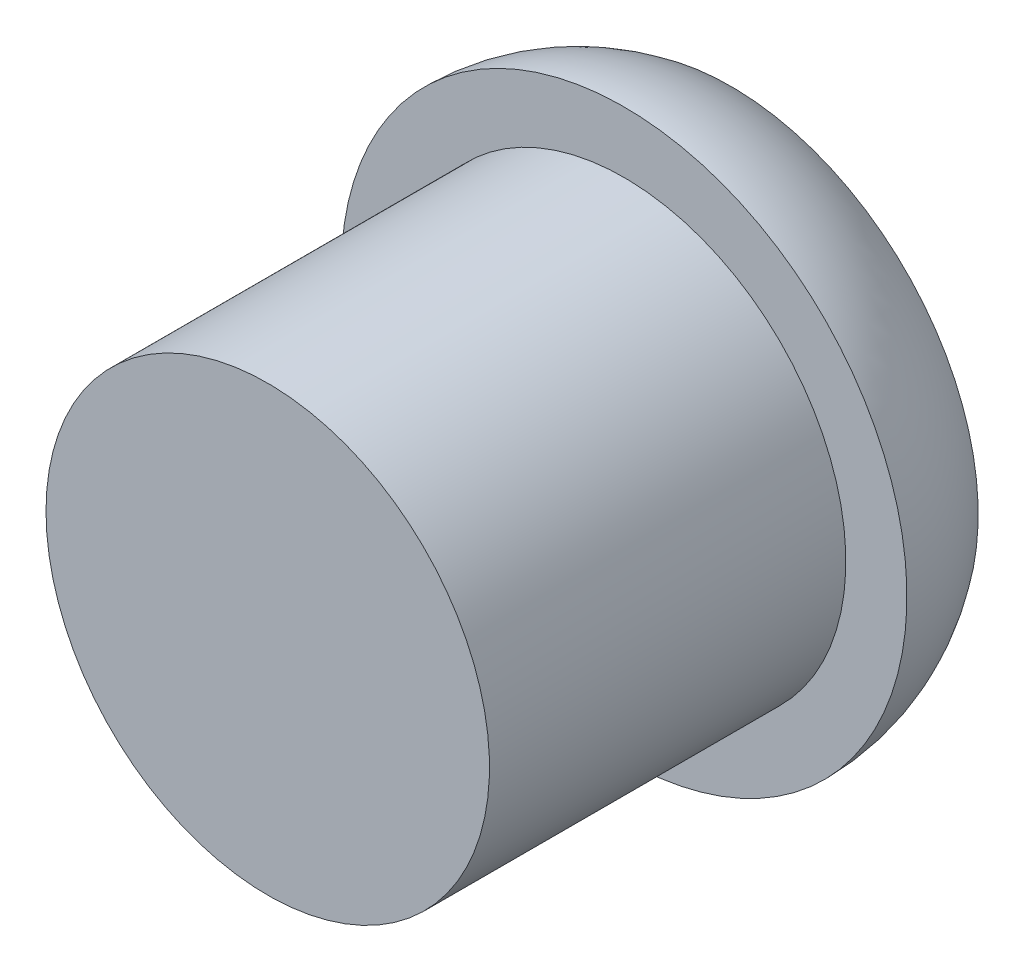
ISO-10303-21;
HEADER;
FILE_DESCRIPTION(('STEP AP214'),'2;1');
FILE_NAME('part.step','',(''),(''),'','','');
FILE_SCHEMA(('AUTOMOTIVE_DESIGN { 1 0 10303 214 1 1 1 1 }'));
ENDSEC;
DATA;
#1=APPLICATION_CONTEXT('core data for automotive mechanical design processes');
#2=APPLICATION_PROTOCOL_DEFINITION('international standard','automotive_design',2000,#1);
#3=PRODUCT_CONTEXT('',#1,'mechanical');
#4=PRODUCT('Part','Part','',(#3));
#5=PRODUCT_RELATED_PRODUCT_CATEGORY('part','',(#4));
#6=PRODUCT_DEFINITION_FORMATION('','',#4);
#7=PRODUCT_DEFINITION_CONTEXT('part definition',#1,'design');
#8=PRODUCT_DEFINITION('design','',#6,#7);
#9=PRODUCT_DEFINITION_SHAPE('','',#8);
#10=(LENGTH_UNIT() NAMED_UNIT(*) SI_UNIT(.MILLI.,.METRE.));
#11=(NAMED_UNIT(*) PLANE_ANGLE_UNIT() SI_UNIT($,.RADIAN.));
#12=(NAMED_UNIT(*) SI_UNIT($,.STERADIAN.) SOLID_ANGLE_UNIT());
#13=UNCERTAINTY_MEASURE_WITH_UNIT(LENGTH_MEASURE(1.E-05),#10,'distance_accuracy_value','');
#14=(GEOMETRIC_REPRESENTATION_CONTEXT(3) GLOBAL_UNCERTAINTY_ASSIGNED_CONTEXT((#13)) GLOBAL_UNIT_ASSIGNED_CONTEXT((#10,
#11,#12)) REPRESENTATION_CONTEXT('',''));
#15=CARTESIAN_POINT('',(0.,0.,0.));
#16=DIRECTION('',(0.,0.,1.));
#17=DIRECTION('',(1.,0.,0.));
#18=AXIS2_PLACEMENT_3D('',#15,#16,#17);
#19=CARTESIAN_POINT('',(0.,0.,10.));
#20=DIRECTION('',(0.,0.,-1.));
#21=DIRECTION('',(-1.,0.,0.));
#22=AXIS2_PLACEMENT_3D('',#19,#20,#21);
#23=PLANE('',#22);
#24=CARTESIAN_POINT('',(0.,0.,10.));
#25=DIRECTION('',(0.,0.,-1.));
#26=DIRECTION('',(-1.,0.,0.));
#27=AXIS2_PLACEMENT_3D('',#24,#25,#26);
#28=CIRCLE('',#27,6.223);
#29=CARTESIAN_POINT('',(-6.223,0.,10.));
#30=VERTEX_POINT('',#29);
#31=EDGE_CURVE('E10',#30,#30,#28,.T.);
#32=ORIENTED_EDGE('',*,*,#31,.F.);
#33=EDGE_LOOP('',(#32));
#34=FACE_BOUND('',#33,.T.);
#35=ADVANCED_FACE('F32',(#34),#23,.F.);
#36=CARTESIAN_POINT('',(0.,0.,-6.));
#37=DIRECTION('',(0.,0.,-1.));
#38=DIRECTION('',(-1.,0.,0.));
#39=AXIS2_PLACEMENT_3D('',#36,#37,#38);
#40=CYLINDRICAL_SURFACE('',#39,6.223);
#41=CARTESIAN_POINT('',(0.,0.,0.));
#42=DIRECTION('',(0.,0.,-1.));
#43=DIRECTION('',(-1.,0.,0.));
#44=AXIS2_PLACEMENT_3D('',#41,#42,#43);
#45=CIRCLE('',#44,6.223);
#46=CARTESIAN_POINT('',(-6.223,0.,0.));
#47=VERTEX_POINT('',#46);
#48=EDGE_CURVE('E38',#47,#47,#45,.T.);
#49=ORIENTED_EDGE('',*,*,#48,.F.);
#50=EDGE_LOOP('',(#49));
#51=FACE_BOUND('',#50,.T.);
#52=ORIENTED_EDGE('',*,*,#31,.T.);
#53=EDGE_LOOP('',(#52));
#54=FACE_BOUND('',#53,.T.);
#55=ADVANCED_FACE('F71',(#51,#54),#40,.T.);
#56=CARTESIAN_POINT('',(6.223,0.,0.));
#57=DIRECTION('',(0.,0.,-1.));
#58=DIRECTION('',(-1.,0.,0.));
#59=AXIS2_PLACEMENT_3D('',#56,#57,#58);
#60=PLANE('',#59);
#61=CARTESIAN_POINT('',(0.,0.,0.));
#62=DIRECTION('',(0.,0.,-1.));
#63=DIRECTION('',(-1.,0.,0.));
#64=AXIS2_PLACEMENT_3D('',#61,#62,#63);
#65=CIRCLE('',#64,7.9375);
#66=CARTESIAN_POINT('',(-7.9375,0.,0.));
#67=VERTEX_POINT('',#66);
#68=EDGE_CURVE('E42',#67,#67,#65,.T.);
#69=ORIENTED_EDGE('',*,*,#68,.F.);
#70=EDGE_LOOP('',(#69));
#71=FACE_BOUND('',#70,.T.);
#72=ORIENTED_EDGE('',*,*,#48,.T.);
#73=EDGE_LOOP('',(#72));
#74=FACE_BOUND('',#73,.T.);
#75=ADVANCED_FACE('F66',(#71,#74),#60,.F.);
#76=CARTESIAN_POINT('',(0.,0.,0.));
#77=DIRECTION('',(0.,0.,-1.));
#78=DIRECTION('',(-1.,0.,0.));
#79=AXIS2_PLACEMENT_3D('',#76,#77,#78);
#80=DEGENERATE_TOROIDAL_SURFACE('',#79,2.9375,5.,.T.);
#81=CARTESIAN_POINT('',(0.,0.,-3.));
#82=DIRECTION('',(0.,0.,-1.));
#83=DIRECTION('',(-1.,0.,0.));
#84=AXIS2_PLACEMENT_3D('',#81,#82,#83);
#85=CIRCLE('',#84,6.9375);
#86=CARTESIAN_POINT('',(-6.9375,0.,-3.));
#87=VERTEX_POINT('',#86);
#88=EDGE_CURVE('E46',#87,#87,#85,.T.);
#89=ORIENTED_EDGE('',*,*,#88,.F.);
#90=EDGE_LOOP('',(#89));
#91=FACE_BOUND('',#90,.T.);
#92=ORIENTED_EDGE('',*,*,#68,.T.);
#93=EDGE_LOOP('',(#92));
#94=FACE_BOUND('',#93,.T.);
#95=ADVANCED_FACE('F60',(#91,#94),#80,.T.);
#96=CARTESIAN_POINT('',(6.9375,0.,-3.));
#97=DIRECTION('',(0.,0.,1.));
#98=DIRECTION('',(1.,0.,0.));
#99=AXIS2_PLACEMENT_3D('',#96,#97,#98);
#100=PLANE('',#99);
#101=CARTESIAN_POINT('',(0.,0.,-3.));
#102=DIRECTION('',(0.,0.,-1.));
#103=DIRECTION('',(-1.,0.,0.));
#104=AXIS2_PLACEMENT_3D('',#101,#102,#103);
#105=CIRCLE('',#104,6.2449979983984);
#106=CARTESIAN_POINT('',(-6.2449979983984,0.,-3.));
#107=VERTEX_POINT('',#106);
#108=EDGE_CURVE('E51',#107,#107,#105,.T.);
#109=ORIENTED_EDGE('',*,*,#108,.F.);
#110=EDGE_LOOP('',(#109));
#111=FACE_BOUND('',#110,.T.);
#112=ORIENTED_EDGE('',*,*,#88,.T.);
#113=EDGE_LOOP('',(#112));
#114=FACE_BOUND('',#113,.T.);
#115=ADVANCED_FACE('F57',(#111,#114),#100,.F.);
#116=CARTESIAN_POINT('',(0.,0.,2.));
#117=DIRECTION('',(0.,0.,-1.));
#118=DIRECTION('',(1.,0.,0.));
#119=AXIS2_PLACEMENT_3D('',#116,#117,#118);
#120=SPHERICAL_SURFACE('',#119,8.);
#121=ORIENTED_EDGE('',*,*,#108,.T.);
#122=EDGE_LOOP('',(#121));
#123=FACE_BOUND('',#122,.T.);
#124=ADVANCED_FACE('F55',(#123),#120,.T.);
#125=CLOSED_SHELL('',(#35,#55,#75,#95,#115,#124));
#126=MANIFOLD_SOLID_BREP('B2',#125);
#127=ADVANCED_BREP_SHAPE_REPRESENTATION('',(#18,#126),#14);
#128=SHAPE_DEFINITION_REPRESENTATION(#9,#127);
ENDSEC;
END-ISO-10303-21;
